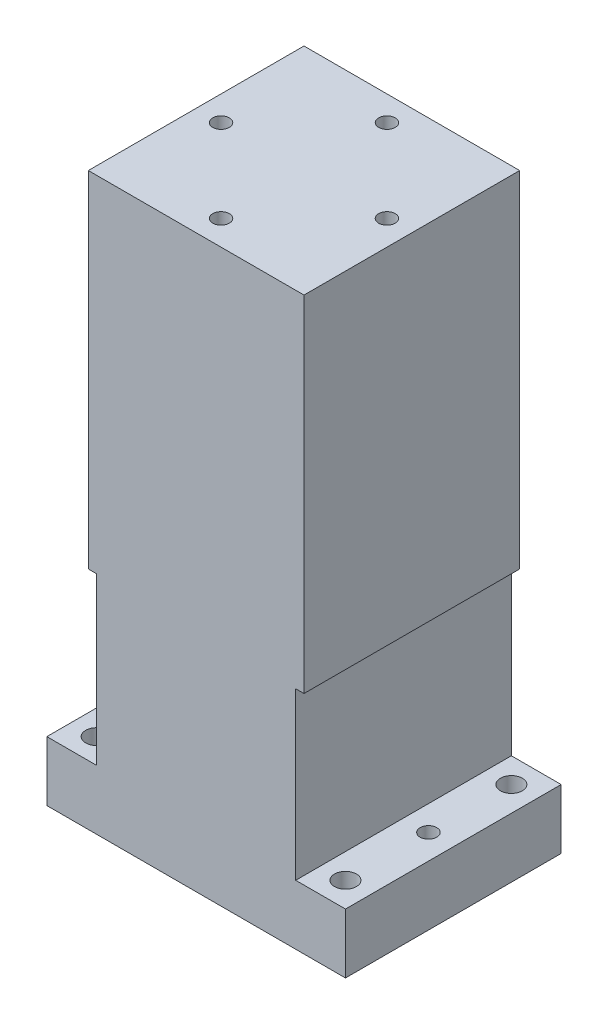
ISO-10303-21;
HEADER;
FILE_DESCRIPTION(('STEP AP214'),'2;1');
FILE_NAME('part.step','',(''),(''),'','','');
FILE_SCHEMA(('AUTOMOTIVE_DESIGN { 1 0 10303 214 1 1 1 1 }'));
ENDSEC;
DATA;
#1=APPLICATION_CONTEXT('core data for automotive mechanical design processes');
#2=APPLICATION_PROTOCOL_DEFINITION('international standard','automotive_design',2000,#1);
#3=PRODUCT_CONTEXT('',#1,'mechanical');
#4=PRODUCT('Part','Part','',(#3));
#5=PRODUCT_RELATED_PRODUCT_CATEGORY('part','',(#4));
#6=PRODUCT_DEFINITION_FORMATION('','',#4);
#7=PRODUCT_DEFINITION_CONTEXT('part definition',#1,'design');
#8=PRODUCT_DEFINITION('design','',#6,#7);
#9=PRODUCT_DEFINITION_SHAPE('','',#8);
#10=(LENGTH_UNIT() NAMED_UNIT(*) SI_UNIT(.MILLI.,.METRE.));
#11=(NAMED_UNIT(*) PLANE_ANGLE_UNIT() SI_UNIT($,.RADIAN.));
#12=(NAMED_UNIT(*) SI_UNIT($,.STERADIAN.) SOLID_ANGLE_UNIT());
#13=UNCERTAINTY_MEASURE_WITH_UNIT(LENGTH_MEASURE(1.E-05),#10,'distance_accuracy_value','');
#14=(GEOMETRIC_REPRESENTATION_CONTEXT(3) GLOBAL_UNCERTAINTY_ASSIGNED_CONTEXT((#13)) GLOBAL_UNIT_ASSIGNED_CONTEXT((#10,
#11,#12)) REPRESENTATION_CONTEXT('',''));
#15=CARTESIAN_POINT('',(0.,0.,0.));
#16=DIRECTION('',(0.,0.,1.));
#17=DIRECTION('',(1.,0.,0.));
#18=AXIS2_PLACEMENT_3D('',#15,#16,#17);
#19=CARTESIAN_POINT('',(30.,18.,-32.5));
#20=DIRECTION('',(0.,-1.,0.));
#21=DIRECTION('',(1.,0.,0.));
#22=AXIS2_PLACEMENT_3D('',#19,#20,#21);
#23=PLANE('',#22);
#24=CARTESIAN_POINT('',(37.5,18.,0.));
#25=DIRECTION('',(0.,1.,0.));
#26=DIRECTION('',(0.,0.,1.));
#27=AXIS2_PLACEMENT_3D('',#24,#25,#26);
#28=CIRCLE('',#27,2.50999999999998);
#29=CARTESIAN_POINT('',(37.5,18.,2.50999999999998));
#30=VERTEX_POINT('',#29);
#31=EDGE_CURVE('E167',#30,#30,#28,.T.);
#32=ORIENTED_EDGE('',*,*,#31,.F.);
#33=EDGE_LOOP('',(#32));
#34=FACE_BOUND('',#33,.T.);
#35=CARTESIAN_POINT('',(37.5,18.,25.));
#36=DIRECTION('',(0.,1.,0.));
#37=DIRECTION('',(0.,0.,1.));
#38=AXIS2_PLACEMENT_3D('',#35,#36,#37);
#39=CIRCLE('',#38,3.29999999999996);
#40=CARTESIAN_POINT('',(37.5,18.,28.3));
#41=VERTEX_POINT('',#40);
#42=EDGE_CURVE('E179',#41,#41,#39,.T.);
#43=ORIENTED_EDGE('',*,*,#42,.F.);
#44=EDGE_LOOP('',(#43));
#45=FACE_BOUND('',#44,.T.);
#46=DIRECTION('',(1.,0.,0.));
#47=VECTOR('',#46,1.);
#48=CARTESIAN_POINT('',(30.,18.,32.5));
#49=LINE('',#48,#47);
#50=CARTESIAN_POINT('',(30.,18.,32.5));
#51=VERTEX_POINT('',#50);
#52=CARTESIAN_POINT('',(45.,18.,32.5));
#53=VERTEX_POINT('',#52);
#54=EDGE_CURVE('E217',#51,#53,#49,.T.);
#55=ORIENTED_EDGE('',*,*,#54,.T.);
#56=DIRECTION('',(0.,0.,1.));
#57=VECTOR('',#56,1.);
#58=CARTESIAN_POINT('',(45.,18.,-32.5));
#59=LINE('',#58,#57);
#60=CARTESIAN_POINT('',(45.,18.,-32.5));
#61=VERTEX_POINT('',#60);
#62=EDGE_CURVE('E222',#61,#53,#59,.T.);
#63=ORIENTED_EDGE('',*,*,#62,.F.);
#64=DIRECTION('',(1.,0.,0.));
#65=VECTOR('',#64,1.);
#66=CARTESIAN_POINT('',(30.,18.,-32.5));
#67=LINE('',#66,#65);
#68=CARTESIAN_POINT('',(30.,18.,-32.5));
#69=VERTEX_POINT('',#68);
#70=EDGE_CURVE('E216',#69,#61,#67,.T.);
#71=ORIENTED_EDGE('',*,*,#70,.F.);
#72=DIRECTION('',(0.,0.,1.));
#73=VECTOR('',#72,1.);
#74=CARTESIAN_POINT('',(30.,18.,-32.5));
#75=LINE('',#74,#73);
#76=EDGE_CURVE('E219',#69,#51,#75,.T.);
#77=ORIENTED_EDGE('',*,*,#76,.T.);
#78=EDGE_LOOP('',(#55,#63,#71,#77));
#79=FACE_BOUND('',#78,.T.);
#80=CARTESIAN_POINT('',(37.5,18.,-25.));
#81=DIRECTION('',(0.,1.,0.));
#82=DIRECTION('',(0.,0.,1.));
#83=AXIS2_PLACEMENT_3D('',#80,#81,#82);
#84=CIRCLE('',#83,3.29999999999996);
#85=CARTESIAN_POINT('',(37.5,18.,-21.7));
#86=VERTEX_POINT('',#85);
#87=EDGE_CURVE('E173',#86,#86,#84,.T.);
#88=ORIENTED_EDGE('',*,*,#87,.F.);
#89=EDGE_LOOP('',(#88));
#90=FACE_BOUND('',#89,.T.);
#91=ADVANCED_FACE('F32',(#34,#45,#79,#90),#23,.F.);
#92=CARTESIAN_POINT('',(30.,172.,-32.5));
#93=DIRECTION('',(-1.,0.,0.));
#94=DIRECTION('',(0.,0.,1.));
#95=AXIS2_PLACEMENT_3D('',#92,#93,#94);
#96=PLANE('',#95);
#97=DIRECTION('',(0.,0.,-1.));
#98=VECTOR('',#97,1.);
#99=CARTESIAN_POINT('',(30.,68.,-32.5));
#100=LINE('',#99,#98);
#101=CARTESIAN_POINT('',(30.,68.,32.5));
#102=VERTEX_POINT('',#101);
#103=CARTESIAN_POINT('',(30.,68.,-32.5));
#104=VERTEX_POINT('',#103);
#105=EDGE_CURVE('E49',#102,#104,#100,.T.);
#106=ORIENTED_EDGE('',*,*,#105,.F.);
#107=DIRECTION('',(0.,-1.,0.));
#108=VECTOR('',#107,1.);
#109=CARTESIAN_POINT('',(30.,172.,32.5));
#110=LINE('',#109,#108);
#111=EDGE_CURVE('E214',#102,#51,#110,.T.);
#112=ORIENTED_EDGE('',*,*,#111,.T.);
#113=ORIENTED_EDGE('',*,*,#76,.F.);
#114=DIRECTION('',(0.,-1.,0.));
#115=VECTOR('',#114,1.);
#116=CARTESIAN_POINT('',(30.,172.,-32.5));
#117=LINE('',#116,#115);
#118=EDGE_CURVE('E56',#104,#69,#117,.T.);
#119=ORIENTED_EDGE('',*,*,#118,.F.);
#120=EDGE_LOOP('',(#106,#112,#113,#119));
#121=FACE_BOUND('',#120,.T.);
#122=ADVANCED_FACE('F304',(#121),#96,.F.);
#123=CARTESIAN_POINT('',(-30.,18.,-32.5));
#124=DIRECTION('',(1.,0.,0.));
#125=DIRECTION('',(0.,1.,0.));
#126=AXIS2_PLACEMENT_3D('',#123,#124,#125);
#127=PLANE('',#126);
#128=DIRECTION('',(0.,0.,1.));
#129=VECTOR('',#128,1.);
#130=CARTESIAN_POINT('',(-30.,68.,32.5));
#131=LINE('',#130,#129);
#132=CARTESIAN_POINT('',(-30.,68.,-32.5));
#133=VERTEX_POINT('',#132);
#134=CARTESIAN_POINT('',(-30.,68.,32.5));
#135=VERTEX_POINT('',#134);
#136=EDGE_CURVE('E225',#133,#135,#131,.T.);
#137=ORIENTED_EDGE('',*,*,#136,.F.);
#138=DIRECTION('',(0.,1.,0.));
#139=VECTOR('',#138,1.);
#140=CARTESIAN_POINT('',(-30.,18.,-32.5));
#141=LINE('',#140,#139);
#142=CARTESIAN_POINT('',(-30.,18.,-32.5));
#143=VERTEX_POINT('',#142);
#144=EDGE_CURVE('E249',#143,#133,#141,.T.);
#145=ORIENTED_EDGE('',*,*,#144,.F.);
#146=DIRECTION('',(0.,0.,1.));
#147=VECTOR('',#146,1.);
#148=CARTESIAN_POINT('',(-30.,18.,-32.5));
#149=LINE('',#148,#147);
#150=CARTESIAN_POINT('',(-30.,18.,32.5));
#151=VERTEX_POINT('',#150);
#152=EDGE_CURVE('E258',#143,#151,#149,.T.);
#153=ORIENTED_EDGE('',*,*,#152,.T.);
#154=DIRECTION('',(0.,1.,0.));
#155=VECTOR('',#154,1.);
#156=CARTESIAN_POINT('',(-30.,18.,32.5));
#157=LINE('',#156,#155);
#158=EDGE_CURVE('E250',#151,#135,#157,.T.);
#159=ORIENTED_EDGE('',*,*,#158,.T.);
#160=EDGE_LOOP('',(#137,#145,#153,#159));
#161=FACE_BOUND('',#160,.T.);
#162=ADVANCED_FACE('F310',(#161),#127,.F.);
#163=CARTESIAN_POINT('',(45.,0.,32.5));
#164=DIRECTION('',(0.,-1.,0.));
#165=DIRECTION('',(0.,0.,-1.));
#166=AXIS2_PLACEMENT_3D('',#163,#164,#165);
#167=PLANE('',#166);
#168=CARTESIAN_POINT('',(37.5,-2.0122792321331E-13,0.));
#169=DIRECTION('',(0.,1.,0.));
#170=DIRECTION('',(0.,0.,1.));
#171=AXIS2_PLACEMENT_3D('',#168,#169,#170);
#172=CIRCLE('',#171,2.50999999999998);
#173=CARTESIAN_POINT('',(37.5,-2.0122792321331E-13,2.50999999999998));
#174=VERTEX_POINT('',#173);
#175=EDGE_CURVE('E170',#174,#174,#172,.T.);
#176=ORIENTED_EDGE('',*,*,#175,.T.);
#177=EDGE_LOOP('',(#176));
#178=FACE_BOUND('',#177,.T.);
#179=CARTESIAN_POINT('',(37.5,-1.04083408558608E-13,-25.));
#180=DIRECTION('',(0.,1.,0.));
#181=DIRECTION('',(0.,0.,1.));
#182=AXIS2_PLACEMENT_3D('',#179,#180,#181);
#183=CIRCLE('',#182,3.29999999999995);
#184=CARTESIAN_POINT('',(37.5,-1.04083408558608E-13,-21.7));
#185=VERTEX_POINT('',#184);
#186=EDGE_CURVE('E176',#185,#185,#183,.T.);
#187=ORIENTED_EDGE('',*,*,#186,.T.);
#188=EDGE_LOOP('',(#187));
#189=FACE_BOUND('',#188,.T.);
#190=CARTESIAN_POINT('',(37.5,-1.04083408558608E-13,25.));
#191=DIRECTION('',(0.,1.,0.));
#192=DIRECTION('',(0.,0.,1.));
#193=AXIS2_PLACEMENT_3D('',#190,#191,#192);
#194=CIRCLE('',#193,3.29999999999995);
#195=CARTESIAN_POINT('',(37.5,-1.04083408558608E-13,28.2999999999999));
#196=VERTEX_POINT('',#195);
#197=EDGE_CURVE('E182',#196,#196,#194,.T.);
#198=ORIENTED_EDGE('',*,*,#197,.T.);
#199=EDGE_LOOP('',(#198));
#200=FACE_BOUND('',#199,.T.);
#201=CARTESIAN_POINT('',(-37.5,0.,0.));
#202=DIRECTION('',(0.,-1.,0.));
#203=DIRECTION('',(0.,0.,-1.));
#204=AXIS2_PLACEMENT_3D('',#201,#202,#203);
#205=CIRCLE('',#204,2.50999999999998);
#206=CARTESIAN_POINT('',(-37.5,0.,-2.50999999999998));
#207=VERTEX_POINT('',#206);
#208=EDGE_CURVE('E185',#207,#207,#205,.T.);
#209=ORIENTED_EDGE('',*,*,#208,.F.);
#210=EDGE_LOOP('',(#209));
#211=FACE_BOUND('',#210,.T.);
#212=CARTESIAN_POINT('',(-37.5,0.,25.));
#213=DIRECTION('',(0.,-1.,0.));
#214=DIRECTION('',(0.,0.,-1.));
#215=AXIS2_PLACEMENT_3D('',#212,#213,#214);
#216=CIRCLE('',#215,3.29999999999996);
#217=CARTESIAN_POINT('',(-37.5,0.,21.7000000000001));
#218=VERTEX_POINT('',#217);
#219=EDGE_CURVE('E188',#218,#218,#216,.T.);
#220=ORIENTED_EDGE('',*,*,#219,.F.);
#221=EDGE_LOOP('',(#220));
#222=FACE_BOUND('',#221,.T.);
#223=CARTESIAN_POINT('',(-37.5,0.,-25.));
#224=DIRECTION('',(0.,-1.,0.));
#225=DIRECTION('',(0.,0.,-1.));
#226=AXIS2_PLACEMENT_3D('',#223,#224,#225);
#227=CIRCLE('',#226,3.29999999999996);
#228=CARTESIAN_POINT('',(-37.5,0.,-28.3));
#229=VERTEX_POINT('',#228);
#230=EDGE_CURVE('E192',#229,#229,#227,.T.);
#231=ORIENTED_EDGE('',*,*,#230,.F.);
#232=EDGE_LOOP('',(#231));
#233=FACE_BOUND('',#232,.T.);
#234=DIRECTION('',(-1.,0.,0.));
#235=VECTOR('',#234,1.);
#236=CARTESIAN_POINT('',(45.,0.,-32.5));
#237=LINE('',#236,#235);
#238=CARTESIAN_POINT('',(45.,0.,-32.5));
#239=VERTEX_POINT('',#238);
#240=CARTESIAN_POINT('',(-45.,0.,-32.5));
#241=VERTEX_POINT('',#240);
#242=EDGE_CURVE('E260',#239,#241,#237,.T.);
#243=ORIENTED_EDGE('',*,*,#242,.F.);
#244=DIRECTION('',(0.,0.,-1.));
#245=VECTOR('',#244,1.);
#246=CARTESIAN_POINT('',(45.,0.,32.5));
#247=LINE('',#246,#245);
#248=CARTESIAN_POINT('',(45.,0.,32.5));
#249=VERTEX_POINT('',#248);
#250=EDGE_CURVE('E11',#249,#239,#247,.T.);
#251=ORIENTED_EDGE('',*,*,#250,.F.);
#252=DIRECTION('',(-1.,0.,0.));
#253=VECTOR('',#252,1.);
#254=CARTESIAN_POINT('',(45.,0.,32.5));
#255=LINE('',#254,#253);
#256=CARTESIAN_POINT('',(-45.,0.,32.5));
#257=VERTEX_POINT('',#256);
#258=EDGE_CURVE('E262',#249,#257,#255,.T.);
#259=ORIENTED_EDGE('',*,*,#258,.T.);
#260=DIRECTION('',(0.,0.,-1.));
#261=VECTOR('',#260,1.);
#262=CARTESIAN_POINT('',(-45.,0.,32.5));
#263=LINE('',#262,#261);
#264=EDGE_CURVE('E41',#257,#241,#263,.T.);
#265=ORIENTED_EDGE('',*,*,#264,.T.);
#266=EDGE_LOOP('',(#243,#251,#259,#265));
#267=FACE_BOUND('',#266,.T.);
#268=ADVANCED_FACE('F34',(#178,#189,#200,#211,#222,#233,#267),#167,.T.);
#269=CARTESIAN_POINT('',(45.,172.,32.5));
#270=DIRECTION('',(1.,0.,0.));
#271=DIRECTION('',(0.,0.,-1.));
#272=AXIS2_PLACEMENT_3D('',#269,#270,#271);
#273=PLANE('',#272);
#274=ORIENTED_EDGE('',*,*,#62,.T.);
#275=DIRECTION('',(0.,-1.,0.));
#276=VECTOR('',#275,1.);
#277=CARTESIAN_POINT('',(45.,172.,32.5));
#278=LINE('',#277,#276);
#279=EDGE_CURVE('E271',#53,#249,#278,.T.);
#280=ORIENTED_EDGE('',*,*,#279,.T.);
#281=ORIENTED_EDGE('',*,*,#250,.T.);
#282=DIRECTION('',(0.,-1.,0.));
#283=VECTOR('',#282,1.);
#284=CARTESIAN_POINT('',(45.,172.,-32.5));
#285=LINE('',#284,#283);
#286=EDGE_CURVE('E266',#61,#239,#285,.T.);
#287=ORIENTED_EDGE('',*,*,#286,.F.);
#288=EDGE_LOOP('',(#274,#280,#281,#287));
#289=FACE_BOUND('',#288,.T.);
#290=ADVANCED_FACE('F340',(#289),#273,.T.);
#291=CARTESIAN_POINT('',(-45.,172.,32.5));
#292=DIRECTION('',(0.,1.,0.));
#293=DIRECTION('',(0.,0.,1.));
#294=AXIS2_PLACEMENT_3D('',#291,#292,#293);
#295=PLANE('',#294);
#296=CARTESIAN_POINT('',(-25.,172.,0.));
#297=DIRECTION('',(0.,1.,0.));
#298=DIRECTION('',(0.,0.,1.));
#299=AXIS2_PLACEMENT_3D('',#296,#297,#298);
#300=CIRCLE('',#299,2.49999999999999);
#301=CARTESIAN_POINT('',(-25.,172.,2.49999999999999));
#302=VERTEX_POINT('',#301);
#303=EDGE_CURVE('E145',#302,#302,#300,.T.);
#304=ORIENTED_EDGE('',*,*,#303,.F.);
#305=EDGE_LOOP('',(#304));
#306=FACE_BOUND('',#305,.T.);
#307=CARTESIAN_POINT('',(25.,172.,0.));
#308=DIRECTION('',(0.,1.,0.));
#309=DIRECTION('',(0.,0.,1.));
#310=AXIS2_PLACEMENT_3D('',#307,#308,#309);
#311=CIRCLE('',#310,2.49999999999999);
#312=CARTESIAN_POINT('',(25.,172.,2.49999999999999));
#313=VERTEX_POINT('',#312);
#314=EDGE_CURVE('E144',#313,#313,#311,.T.);
#315=ORIENTED_EDGE('',*,*,#314,.F.);
#316=EDGE_LOOP('',(#315));
#317=FACE_BOUND('',#316,.T.);
#318=CARTESIAN_POINT('',(0.,172.,-25.));
#319=DIRECTION('',(0.,1.,0.));
#320=DIRECTION('',(0.,0.,1.));
#321=AXIS2_PLACEMENT_3D('',#318,#319,#320);
#322=CIRCLE('',#321,2.49999999999999);
#323=CARTESIAN_POINT('',(0.,172.,-22.5));
#324=VERTEX_POINT('',#323);
#325=EDGE_CURVE('E155',#324,#324,#322,.T.);
#326=ORIENTED_EDGE('',*,*,#325,.F.);
#327=EDGE_LOOP('',(#326));
#328=FACE_BOUND('',#327,.T.);
#329=CARTESIAN_POINT('',(0.,172.,25.));
#330=DIRECTION('',(0.,1.,0.));
#331=DIRECTION('',(0.,0.,1.));
#332=AXIS2_PLACEMENT_3D('',#329,#330,#331);
#333=CIRCLE('',#332,2.49999999999999);
#334=CARTESIAN_POINT('',(0.,172.,27.5));
#335=VERTEX_POINT('',#334);
#336=EDGE_CURVE('E161',#335,#335,#333,.T.);
#337=ORIENTED_EDGE('',*,*,#336,.F.);
#338=EDGE_LOOP('',(#337));
#339=FACE_BOUND('',#338,.T.);
#340=DIRECTION('',(1.,0.,0.));
#341=VECTOR('',#340,1.);
#342=CARTESIAN_POINT('',(-45.,172.,32.5));
#343=LINE('',#342,#341);
#344=CARTESIAN_POINT('',(-32.5,172.,32.5));
#345=VERTEX_POINT('',#344);
#346=CARTESIAN_POINT('',(32.5,172.,32.5));
#347=VERTEX_POINT('',#346);
#348=EDGE_CURVE('E269',#345,#347,#343,.T.);
#349=ORIENTED_EDGE('',*,*,#348,.T.);
#350=DIRECTION('',(0.,0.,1.));
#351=VECTOR('',#350,1.);
#352=CARTESIAN_POINT('',(32.5,172.,32.5));
#353=LINE('',#352,#351);
#354=CARTESIAN_POINT('',(32.5,172.,-32.5));
#355=VERTEX_POINT('',#354);
#356=EDGE_CURVE('E201',#355,#347,#353,.T.);
#357=ORIENTED_EDGE('',*,*,#356,.F.);
#358=DIRECTION('',(1.,0.,0.));
#359=VECTOR('',#358,1.);
#360=CARTESIAN_POINT('',(-45.,172.,-32.5));
#361=LINE('',#360,#359);
#362=CARTESIAN_POINT('',(-32.5,172.,-32.5));
#363=VERTEX_POINT('',#362);
#364=EDGE_CURVE('E278',#363,#355,#361,.T.);
#365=ORIENTED_EDGE('',*,*,#364,.F.);
#366=DIRECTION('',(0.,0.,-1.));
#367=VECTOR('',#366,1.);
#368=CARTESIAN_POINT('',(-32.5,172.,-32.5));
#369=LINE('',#368,#367);
#370=EDGE_CURVE('E236',#345,#363,#369,.T.);
#371=ORIENTED_EDGE('',*,*,#370,.F.);
#372=EDGE_LOOP('',(#349,#357,#365,#371));
#373=FACE_BOUND('',#372,.T.);
#374=ADVANCED_FACE('F343',(#306,#317,#328,#339,#373),#295,.T.);
#375=CARTESIAN_POINT('',(-45.,0.,32.5));
#376=DIRECTION('',(-1.,0.,0.));
#377=DIRECTION('',(0.,0.,1.));
#378=AXIS2_PLACEMENT_3D('',#375,#376,#377);
#379=PLANE('',#378);
#380=DIRECTION('',(0.,0.,1.));
#381=VECTOR('',#380,1.);
#382=CARTESIAN_POINT('',(-45.,18.,-32.5));
#383=LINE('',#382,#381);
#384=CARTESIAN_POINT('',(-45.,18.,-32.5));
#385=VERTEX_POINT('',#384);
#386=CARTESIAN_POINT('',(-45.,18.,32.5));
#387=VERTEX_POINT('',#386);
#388=EDGE_CURVE('E253',#385,#387,#383,.T.);
#389=ORIENTED_EDGE('',*,*,#388,.F.);
#390=DIRECTION('',(0.,1.,0.));
#391=VECTOR('',#390,1.);
#392=CARTESIAN_POINT('',(-45.,0.,-32.5));
#393=LINE('',#392,#391);
#394=EDGE_CURVE('E275',#241,#385,#393,.T.);
#395=ORIENTED_EDGE('',*,*,#394,.F.);
#396=ORIENTED_EDGE('',*,*,#264,.F.);
#397=DIRECTION('',(0.,1.,0.));
#398=VECTOR('',#397,1.);
#399=CARTESIAN_POINT('',(-45.,0.,32.5));
#400=LINE('',#399,#398);
#401=EDGE_CURVE('E265',#257,#387,#400,.T.);
#402=ORIENTED_EDGE('',*,*,#401,.T.);
#403=EDGE_LOOP('',(#389,#395,#396,#402));
#404=FACE_BOUND('',#403,.T.);
#405=ADVANCED_FACE('F336',(#404),#379,.T.);
#406=CARTESIAN_POINT('',(0.,0.,32.5));
#407=DIRECTION('',(0.,0.,-1.));
#408=DIRECTION('',(-1.,0.,0.));
#409=AXIS2_PLACEMENT_3D('',#406,#407,#408);
#410=PLANE('',#409);
#411=ORIENTED_EDGE('',*,*,#279,.F.);
#412=ORIENTED_EDGE('',*,*,#54,.F.);
#413=ORIENTED_EDGE('',*,*,#111,.F.);
#414=DIRECTION('',(-1.,0.,0.));
#415=VECTOR('',#414,1.);
#416=CARTESIAN_POINT('',(32.5,68.,32.5));
#417=LINE('',#416,#415);
#418=CARTESIAN_POINT('',(32.5,68.,32.5));
#419=VERTEX_POINT('',#418);
#420=EDGE_CURVE('E211',#419,#102,#417,.T.);
#421=ORIENTED_EDGE('',*,*,#420,.F.);
#422=DIRECTION('',(0.,-1.,0.));
#423=VECTOR('',#422,1.);
#424=CARTESIAN_POINT('',(32.5,68.,32.5));
#425=LINE('',#424,#423);
#426=EDGE_CURVE('E204',#347,#419,#425,.T.);
#427=ORIENTED_EDGE('',*,*,#426,.F.);
#428=ORIENTED_EDGE('',*,*,#348,.F.);
#429=DIRECTION('',(0.,1.,0.));
#430=VECTOR('',#429,1.);
#431=CARTESIAN_POINT('',(-32.5,172.,32.5));
#432=LINE('',#431,#430);
#433=CARTESIAN_POINT('',(-32.5,68.,32.5));
#434=VERTEX_POINT('',#433);
#435=EDGE_CURVE('E233',#434,#345,#432,.T.);
#436=ORIENTED_EDGE('',*,*,#435,.F.);
#437=DIRECTION('',(1.,0.,0.));
#438=VECTOR('',#437,1.);
#439=CARTESIAN_POINT('',(-32.5,68.,32.5));
#440=LINE('',#439,#438);
#441=EDGE_CURVE('E239',#434,#135,#440,.T.);
#442=ORIENTED_EDGE('',*,*,#441,.T.);
#443=ORIENTED_EDGE('',*,*,#158,.F.);
#444=DIRECTION('',(1.,0.,0.));
#445=VECTOR('',#444,1.);
#446=CARTESIAN_POINT('',(-45.,18.,32.5));
#447=LINE('',#446,#445);
#448=EDGE_CURVE('E245',#387,#151,#447,.T.);
#449=ORIENTED_EDGE('',*,*,#448,.F.);
#450=ORIENTED_EDGE('',*,*,#401,.F.);
#451=ORIENTED_EDGE('',*,*,#258,.F.);
#452=EDGE_LOOP('',(#411,#412,#413,#421,#427,#428,#436,#442,#443,#449,#450,#451));
#453=FACE_BOUND('',#452,.T.);
#454=ADVANCED_FACE('F333',(#453),#410,.F.);
#455=CARTESIAN_POINT('',(0.,0.,-32.5));
#456=DIRECTION('',(0.,0.,-1.));
#457=DIRECTION('',(-1.,0.,0.));
#458=AXIS2_PLACEMENT_3D('',#455,#456,#457);
#459=PLANE('',#458);
#460=ORIENTED_EDGE('',*,*,#70,.T.);
#461=ORIENTED_EDGE('',*,*,#286,.T.);
#462=ORIENTED_EDGE('',*,*,#242,.T.);
#463=ORIENTED_EDGE('',*,*,#394,.T.);
#464=DIRECTION('',(1.,0.,0.));
#465=VECTOR('',#464,1.);
#466=CARTESIAN_POINT('',(-45.,18.,-32.5));
#467=LINE('',#466,#465);
#468=EDGE_CURVE('E246',#385,#143,#467,.T.);
#469=ORIENTED_EDGE('',*,*,#468,.T.);
#470=ORIENTED_EDGE('',*,*,#144,.T.);
#471=DIRECTION('',(1.,0.,0.));
#472=VECTOR('',#471,1.);
#473=CARTESIAN_POINT('',(-32.5,68.,-32.5));
#474=LINE('',#473,#472);
#475=CARTESIAN_POINT('',(-32.5,68.,-32.5));
#476=VERTEX_POINT('',#475);
#477=EDGE_CURVE('E243',#476,#133,#474,.T.);
#478=ORIENTED_EDGE('',*,*,#477,.F.);
#479=DIRECTION('',(0.,-1.,0.));
#480=VECTOR('',#479,1.);
#481=CARTESIAN_POINT('',(-32.5,68.,-32.5));
#482=LINE('',#481,#480);
#483=EDGE_CURVE('E228',#363,#476,#482,.T.);
#484=ORIENTED_EDGE('',*,*,#483,.F.);
#485=ORIENTED_EDGE('',*,*,#364,.T.);
#486=DIRECTION('',(0.,1.,0.));
#487=VECTOR('',#486,1.);
#488=CARTESIAN_POINT('',(32.5,172.,-32.5));
#489=LINE('',#488,#487);
#490=CARTESIAN_POINT('',(32.5,68.,-32.5));
#491=VERTEX_POINT('',#490);
#492=EDGE_CURVE('E198',#491,#355,#489,.T.);
#493=ORIENTED_EDGE('',*,*,#492,.F.);
#494=DIRECTION('',(-1.,0.,0.));
#495=VECTOR('',#494,1.);
#496=CARTESIAN_POINT('',(32.5,68.,-32.5));
#497=LINE('',#496,#495);
#498=EDGE_CURVE('E208',#491,#104,#497,.T.);
#499=ORIENTED_EDGE('',*,*,#498,.T.);
#500=ORIENTED_EDGE('',*,*,#118,.T.);
#501=EDGE_LOOP('',(#460,#461,#462,#463,#469,#470,#478,#484,#485,#493,#499,#500));
#502=FACE_BOUND('',#501,.T.);
#503=ADVANCED_FACE('F331',(#502),#459,.T.);
#504=CARTESIAN_POINT('',(-45.,18.,-32.5));
#505=DIRECTION('',(0.,-1.,0.));
#506=DIRECTION('',(1.,0.,0.));
#507=AXIS2_PLACEMENT_3D('',#504,#505,#506);
#508=PLANE('',#507);
#509=CARTESIAN_POINT('',(-37.5,18.,0.));
#510=DIRECTION('',(0.,-1.,0.));
#511=DIRECTION('',(1.,0.,0.));
#512=AXIS2_PLACEMENT_3D('',#509,#510,#511);
#513=CIRCLE('',#512,2.50999999999997);
#514=CARTESIAN_POINT('',(-34.99,18.,0.));
#515=VERTEX_POINT('',#514);
#516=EDGE_CURVE('E36',#515,#515,#513,.T.);
#517=ORIENTED_EDGE('',*,*,#516,.T.);
#518=EDGE_LOOP('',(#517));
#519=FACE_BOUND('',#518,.T.);
#520=CARTESIAN_POINT('',(-37.5,18.,25.));
#521=DIRECTION('',(0.,-1.,0.));
#522=DIRECTION('',(1.,0.,0.));
#523=AXIS2_PLACEMENT_3D('',#520,#521,#522);
#524=CIRCLE('',#523,3.29999999999995);
#525=CARTESIAN_POINT('',(-34.2000000000001,18.,25.));
#526=VERTEX_POINT('',#525);
#527=EDGE_CURVE('E191',#526,#526,#524,.T.);
#528=ORIENTED_EDGE('',*,*,#527,.T.);
#529=EDGE_LOOP('',(#528));
#530=FACE_BOUND('',#529,.T.);
#531=CARTESIAN_POINT('',(-37.5,18.,-25.));
#532=DIRECTION('',(0.,-1.,0.));
#533=DIRECTION('',(1.,0.,0.));
#534=AXIS2_PLACEMENT_3D('',#531,#532,#533);
#535=CIRCLE('',#534,3.29999999999995);
#536=CARTESIAN_POINT('',(-34.2000000000001,18.,-25.));
#537=VERTEX_POINT('',#536);
#538=EDGE_CURVE('E195',#537,#537,#535,.T.);
#539=ORIENTED_EDGE('',*,*,#538,.T.);
#540=EDGE_LOOP('',(#539));
#541=FACE_BOUND('',#540,.T.);
#542=ORIENTED_EDGE('',*,*,#448,.T.);
#543=ORIENTED_EDGE('',*,*,#152,.F.);
#544=ORIENTED_EDGE('',*,*,#468,.F.);
#545=ORIENTED_EDGE('',*,*,#388,.T.);
#546=EDGE_LOOP('',(#542,#543,#544,#545));
#547=FACE_BOUND('',#546,.T.);
#548=ADVANCED_FACE('F284',(#519,#530,#541,#547),#508,.F.);
#549=CARTESIAN_POINT('',(-32.5,68.,32.5));
#550=DIRECTION('',(0.,1.,0.));
#551=DIRECTION('',(-1.,0.,0.));
#552=AXIS2_PLACEMENT_3D('',#549,#550,#551);
#553=PLANE('',#552);
#554=ORIENTED_EDGE('',*,*,#136,.T.);
#555=ORIENTED_EDGE('',*,*,#441,.F.);
#556=DIRECTION('',(0.,0.,1.));
#557=VECTOR('',#556,1.);
#558=CARTESIAN_POINT('',(-32.5,68.,32.5));
#559=LINE('',#558,#557);
#560=EDGE_CURVE('E231',#476,#434,#559,.T.);
#561=ORIENTED_EDGE('',*,*,#560,.F.);
#562=ORIENTED_EDGE('',*,*,#477,.T.);
#563=EDGE_LOOP('',(#554,#555,#561,#562));
#564=FACE_BOUND('',#563,.T.);
#565=ADVANCED_FACE('F321',(#564),#553,.F.);
#566=CARTESIAN_POINT('',(-32.5,0.,0.));
#567=DIRECTION('',(1.,0.,0.));
#568=DIRECTION('',(0.,1.,0.));
#569=AXIS2_PLACEMENT_3D('',#566,#567,#568);
#570=PLANE('',#569);
#571=ORIENTED_EDGE('',*,*,#483,.T.);
#572=ORIENTED_EDGE('',*,*,#560,.T.);
#573=ORIENTED_EDGE('',*,*,#435,.T.);
#574=ORIENTED_EDGE('',*,*,#370,.T.);
#575=EDGE_LOOP('',(#571,#572,#573,#574));
#576=FACE_BOUND('',#575,.T.);
#577=ADVANCED_FACE('F318',(#576),#570,.F.);
#578=CARTESIAN_POINT('',(32.5,68.,-32.5));
#579=DIRECTION('',(0.,1.,0.));
#580=DIRECTION('',(0.,0.,1.));
#581=AXIS2_PLACEMENT_3D('',#578,#579,#580);
#582=PLANE('',#581);
#583=ORIENTED_EDGE('',*,*,#105,.T.);
#584=ORIENTED_EDGE('',*,*,#498,.F.);
#585=DIRECTION('',(0.,0.,-1.));
#586=VECTOR('',#585,1.);
#587=CARTESIAN_POINT('',(32.5,68.,-32.5));
#588=LINE('',#587,#586);
#589=EDGE_CURVE('E206',#419,#491,#588,.T.);
#590=ORIENTED_EDGE('',*,*,#589,.F.);
#591=ORIENTED_EDGE('',*,*,#420,.T.);
#592=EDGE_LOOP('',(#583,#584,#590,#591));
#593=FACE_BOUND('',#592,.T.);
#594=ADVANCED_FACE('F315',(#593),#582,.F.);
#595=CARTESIAN_POINT('',(32.5,0.,0.));
#596=DIRECTION('',(-1.,0.,0.));
#597=DIRECTION('',(0.,0.,1.));
#598=AXIS2_PLACEMENT_3D('',#595,#596,#597);
#599=PLANE('',#598);
#600=ORIENTED_EDGE('',*,*,#492,.T.);
#601=ORIENTED_EDGE('',*,*,#356,.T.);
#602=ORIENTED_EDGE('',*,*,#426,.T.);
#603=ORIENTED_EDGE('',*,*,#589,.T.);
#604=EDGE_LOOP('',(#600,#601,#602,#603));
#605=FACE_BOUND('',#604,.T.);
#606=ADVANCED_FACE('F300',(#605),#599,.F.);
#607=CARTESIAN_POINT('',(-37.5,0.,-25.));
#608=DIRECTION('',(0.,-1.,0.));
#609=DIRECTION('',(0.,0.,-1.));
#610=AXIS2_PLACEMENT_3D('',#607,#608,#609);
#611=CYLINDRICAL_SURFACE('',#610,3.29999999999995);
#612=ORIENTED_EDGE('',*,*,#230,.T.);
#613=EDGE_LOOP('',(#612));
#614=FACE_BOUND('',#613,.T.);
#615=ORIENTED_EDGE('',*,*,#538,.F.);
#616=EDGE_LOOP('',(#615));
#617=FACE_BOUND('',#616,.T.);
#618=ADVANCED_FACE('F290',(#614,#617),#611,.F.);
#619=CARTESIAN_POINT('',(-37.5,0.,25.));
#620=DIRECTION('',(0.,-1.,0.));
#621=DIRECTION('',(0.,0.,-1.));
#622=AXIS2_PLACEMENT_3D('',#619,#620,#621);
#623=CYLINDRICAL_SURFACE('',#622,3.29999999999995);
#624=ORIENTED_EDGE('',*,*,#219,.T.);
#625=EDGE_LOOP('',(#624));
#626=FACE_BOUND('',#625,.T.);
#627=ORIENTED_EDGE('',*,*,#527,.F.);
#628=EDGE_LOOP('',(#627));
#629=FACE_BOUND('',#628,.T.);
#630=ADVANCED_FACE('F287',(#626,#629),#623,.F.);
#631=CARTESIAN_POINT('',(-37.5,0.,0.));
#632=DIRECTION('',(0.,-1.,0.));
#633=DIRECTION('',(0.,0.,-1.));
#634=AXIS2_PLACEMENT_3D('',#631,#632,#633);
#635=CYLINDRICAL_SURFACE('',#634,2.50999999999997);
#636=ORIENTED_EDGE('',*,*,#208,.T.);
#637=EDGE_LOOP('',(#636));
#638=FACE_BOUND('',#637,.T.);
#639=ORIENTED_EDGE('',*,*,#516,.F.);
#640=EDGE_LOOP('',(#639));
#641=FACE_BOUND('',#640,.T.);
#642=ADVANCED_FACE('F289',(#638,#641),#635,.F.);
#643=CARTESIAN_POINT('',(37.5,18.,25.));
#644=DIRECTION('',(0.,1.,0.));
#645=DIRECTION('',(0.,0.,1.));
#646=AXIS2_PLACEMENT_3D('',#643,#644,#645);
#647=CYLINDRICAL_SURFACE('',#646,3.29999999999995);
#648=ORIENTED_EDGE('',*,*,#197,.F.);
#649=EDGE_LOOP('',(#648));
#650=FACE_BOUND('',#649,.T.);
#651=ORIENTED_EDGE('',*,*,#42,.T.);
#652=EDGE_LOOP('',(#651));
#653=FACE_BOUND('',#652,.T.);
#654=ADVANCED_FACE('F297',(#650,#653),#647,.F.);
#655=CARTESIAN_POINT('',(37.5,18.,-25.));
#656=DIRECTION('',(0.,1.,0.));
#657=DIRECTION('',(0.,0.,1.));
#658=AXIS2_PLACEMENT_3D('',#655,#656,#657);
#659=CYLINDRICAL_SURFACE('',#658,3.29999999999995);
#660=ORIENTED_EDGE('',*,*,#186,.F.);
#661=EDGE_LOOP('',(#660));
#662=FACE_BOUND('',#661,.T.);
#663=ORIENTED_EDGE('',*,*,#87,.T.);
#664=EDGE_LOOP('',(#663));
#665=FACE_BOUND('',#664,.T.);
#666=ADVANCED_FACE('F385',(#662,#665),#659,.F.);
#667=CARTESIAN_POINT('',(37.5,18.,0.));
#668=DIRECTION('',(0.,1.,0.));
#669=DIRECTION('',(0.,0.,1.));
#670=AXIS2_PLACEMENT_3D('',#667,#668,#669);
#671=CYLINDRICAL_SURFACE('',#670,2.50999999999998);
#672=ORIENTED_EDGE('',*,*,#175,.F.);
#673=EDGE_LOOP('',(#672));
#674=FACE_BOUND('',#673,.T.);
#675=ORIENTED_EDGE('',*,*,#31,.T.);
#676=EDGE_LOOP('',(#675));
#677=FACE_BOUND('',#676,.T.);
#678=ADVANCED_FACE('F387',(#674,#677),#671,.F.);
#679=CARTESIAN_POINT('',(0.,155.,25.));
#680=DIRECTION('',(0.,1.,0.));
#681=DIRECTION('',(0.,0.,1.));
#682=AXIS2_PLACEMENT_3D('',#679,#680,#681);
#683=CONICAL_SURFACE('',#682,2.49999999999998,1.02974425865519);
#684=CARTESIAN_POINT('',(0.,153.497848452358,25.));
#685=VERTEX_POINT('',#684);
#686=VERTEX_LOOP('',#685);
#687=FACE_BOUND('',#686,.T.);
#688=CARTESIAN_POINT('',(0.,155.,25.));
#689=DIRECTION('',(0.,1.,0.));
#690=DIRECTION('',(0.,0.,1.));
#691=AXIS2_PLACEMENT_3D('',#688,#689,#690);
#692=CIRCLE('',#691,2.49999999999998);
#693=CARTESIAN_POINT('',(0.,155.,27.5));
#694=VERTEX_POINT('',#693);
#695=EDGE_CURVE('E164',#694,#694,#692,.T.);
#696=ORIENTED_EDGE('',*,*,#695,.T.);
#697=EDGE_LOOP('',(#696));
#698=FACE_BOUND('',#697,.T.);
#699=ADVANCED_FACE('F394',(#687,#698),#683,.F.);
#700=CARTESIAN_POINT('',(0.,172.,25.));
#701=DIRECTION('',(0.,1.,0.));
#702=DIRECTION('',(0.,0.,1.));
#703=AXIS2_PLACEMENT_3D('',#700,#701,#702);
#704=CYLINDRICAL_SURFACE('',#703,2.49999999999999);
#705=ORIENTED_EDGE('',*,*,#695,.F.);
#706=EDGE_LOOP('',(#705));
#707=FACE_BOUND('',#706,.T.);
#708=ORIENTED_EDGE('',*,*,#336,.T.);
#709=EDGE_LOOP('',(#708));
#710=FACE_BOUND('',#709,.T.);
#711=ADVANCED_FACE('F403',(#707,#710),#704,.F.);
#712=CARTESIAN_POINT('',(0.,155.,-25.));
#713=DIRECTION('',(0.,1.,0.));
#714=DIRECTION('',(0.,0.,1.));
#715=AXIS2_PLACEMENT_3D('',#712,#713,#714);
#716=CONICAL_SURFACE('',#715,2.49999999999998,1.02974425865519);
#717=CARTESIAN_POINT('',(0.,153.497848452358,-25.));
#718=VERTEX_POINT('',#717);
#719=VERTEX_LOOP('',#718);
#720=FACE_BOUND('',#719,.T.);
#721=CARTESIAN_POINT('',(0.,155.,-25.));
#722=DIRECTION('',(0.,1.,0.));
#723=DIRECTION('',(0.,0.,1.));
#724=AXIS2_PLACEMENT_3D('',#721,#722,#723);
#725=CIRCLE('',#724,2.49999999999998);
#726=CARTESIAN_POINT('',(0.,155.,-22.5));
#727=VERTEX_POINT('',#726);
#728=EDGE_CURVE('E158',#727,#727,#725,.T.);
#729=ORIENTED_EDGE('',*,*,#728,.T.);
#730=EDGE_LOOP('',(#729));
#731=FACE_BOUND('',#730,.T.);
#732=ADVANCED_FACE('F407',(#720,#731),#716,.F.);
#733=CARTESIAN_POINT('',(0.,172.,-25.));
#734=DIRECTION('',(0.,1.,0.));
#735=DIRECTION('',(0.,0.,1.));
#736=AXIS2_PLACEMENT_3D('',#733,#734,#735);
#737=CYLINDRICAL_SURFACE('',#736,2.49999999999999);
#738=ORIENTED_EDGE('',*,*,#728,.F.);
#739=EDGE_LOOP('',(#738));
#740=FACE_BOUND('',#739,.T.);
#741=ORIENTED_EDGE('',*,*,#325,.T.);
#742=EDGE_LOOP('',(#741));
#743=FACE_BOUND('',#742,.T.);
#744=ADVANCED_FACE('F411',(#740,#743),#737,.F.);
#745=CARTESIAN_POINT('',(25.,155.,0.));
#746=DIRECTION('',(0.,1.,0.));
#747=DIRECTION('',(0.,0.,1.));
#748=AXIS2_PLACEMENT_3D('',#745,#746,#747);
#749=CONICAL_SURFACE('',#748,2.49999999999998,1.02974425865519);
#750=CARTESIAN_POINT('',(25.,153.497848452358,0.));
#751=VERTEX_POINT('',#750);
#752=VERTEX_LOOP('',#751);
#753=FACE_BOUND('',#752,.T.);
#754=CARTESIAN_POINT('',(25.,155.,0.));
#755=DIRECTION('',(0.,1.,0.));
#756=DIRECTION('',(0.,0.,1.));
#757=AXIS2_PLACEMENT_3D('',#754,#755,#756);
#758=CIRCLE('',#757,2.49999999999998);
#759=CARTESIAN_POINT('',(25.,155.,2.49999999999998));
#760=VERTEX_POINT('',#759);
#761=EDGE_CURVE('E148',#760,#760,#758,.T.);
#762=ORIENTED_EDGE('',*,*,#761,.T.);
#763=EDGE_LOOP('',(#762));
#764=FACE_BOUND('',#763,.T.);
#765=ADVANCED_FACE('F415',(#753,#764),#749,.F.);
#766=CARTESIAN_POINT('',(25.,172.,0.));
#767=DIRECTION('',(0.,1.,0.));
#768=DIRECTION('',(0.,0.,1.));
#769=AXIS2_PLACEMENT_3D('',#766,#767,#768);
#770=CYLINDRICAL_SURFACE('',#769,2.49999999999999);
#771=ORIENTED_EDGE('',*,*,#761,.F.);
#772=EDGE_LOOP('',(#771));
#773=FACE_BOUND('',#772,.T.);
#774=ORIENTED_EDGE('',*,*,#314,.T.);
#775=EDGE_LOOP('',(#774));
#776=FACE_BOUND('',#775,.T.);
#777=ADVANCED_FACE('F138',(#773,#776),#770,.F.);
#778=CARTESIAN_POINT('',(-25.,155.,0.));
#779=DIRECTION('',(0.,1.,0.));
#780=DIRECTION('',(0.,0.,1.));
#781=AXIS2_PLACEMENT_3D('',#778,#779,#780);
#782=CONICAL_SURFACE('',#781,2.49999999999998,1.02974425865519);
#783=CARTESIAN_POINT('',(-25.,153.497848452358,0.));
#784=VERTEX_POINT('',#783);
#785=VERTEX_LOOP('',#784);
#786=FACE_BOUND('',#785,.T.);
#787=CARTESIAN_POINT('',(-25.,155.,0.));
#788=DIRECTION('',(0.,1.,0.));
#789=DIRECTION('',(0.,0.,1.));
#790=AXIS2_PLACEMENT_3D('',#787,#788,#789);
#791=CIRCLE('',#790,2.49999999999998);
#792=CARTESIAN_POINT('',(-25.,155.,2.49999999999998));
#793=VERTEX_POINT('',#792);
#794=EDGE_CURVE('E142',#793,#793,#791,.T.);
#795=ORIENTED_EDGE('',*,*,#794,.T.);
#796=EDGE_LOOP('',(#795));
#797=FACE_BOUND('',#796,.T.);
#798=ADVANCED_FACE('F134',(#786,#797),#782,.F.);
#799=CARTESIAN_POINT('',(-25.,172.,0.));
#800=DIRECTION('',(0.,1.,0.));
#801=DIRECTION('',(0.,0.,1.));
#802=AXIS2_PLACEMENT_3D('',#799,#800,#801);
#803=CYLINDRICAL_SURFACE('',#802,2.49999999999999);
#804=ORIENTED_EDGE('',*,*,#794,.F.);
#805=EDGE_LOOP('',(#804));
#806=FACE_BOUND('',#805,.T.);
#807=ORIENTED_EDGE('',*,*,#303,.T.);
#808=EDGE_LOOP('',(#807));
#809=FACE_BOUND('',#808,.T.);
#810=ADVANCED_FACE('F137',(#806,#809),#803,.F.);
#811=CLOSED_SHELL('',(#91,#122,#162,#268,#290,#374,#405,#454,#503,#548,#565,#577,#594,#606,#618,
#630,#642,#654,#666,#678,#699,#711,#732,#744,#765,#777,#798,#810));
#812=MANIFOLD_SOLID_BREP('B2',#811);
#813=ADVANCED_BREP_SHAPE_REPRESENTATION('',(#18,#812),#14);
#814=SHAPE_DEFINITION_REPRESENTATION(#9,#813);
ENDSEC;
END-ISO-10303-21;
